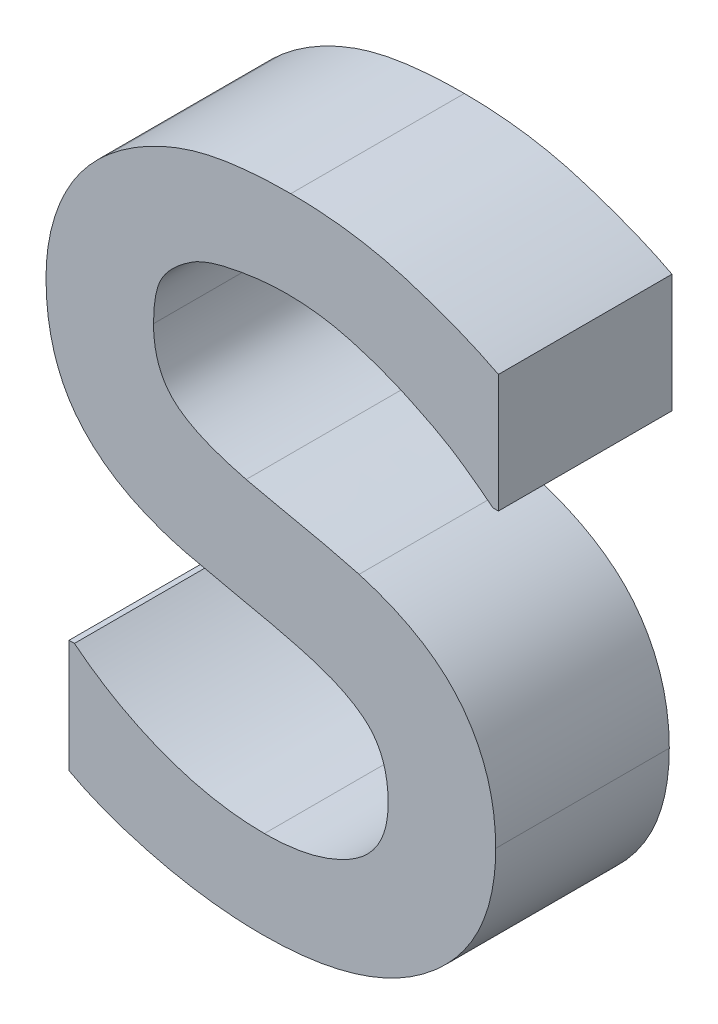
ISO-10303-21;
HEADER;
FILE_DESCRIPTION(('STEP AP214'),'2;1');
FILE_NAME('part.step','',(''),(''),'','','');
FILE_SCHEMA(('AUTOMOTIVE_DESIGN { 1 0 10303 214 1 1 1 1 }'));
ENDSEC;
DATA;
#1=APPLICATION_CONTEXT('core data for automotive mechanical design processes');
#2=APPLICATION_PROTOCOL_DEFINITION('international standard','automotive_design',2000,#1);
#3=PRODUCT_CONTEXT('',#1,'mechanical');
#4=PRODUCT('Part','Part','',(#3));
#5=PRODUCT_RELATED_PRODUCT_CATEGORY('part','',(#4));
#6=PRODUCT_DEFINITION_FORMATION('','',#4);
#7=PRODUCT_DEFINITION_CONTEXT('part definition',#1,'design');
#8=PRODUCT_DEFINITION('design','',#6,#7);
#9=PRODUCT_DEFINITION_SHAPE('','',#8);
#10=(LENGTH_UNIT() NAMED_UNIT(*) SI_UNIT(.MILLI.,.METRE.));
#11=(NAMED_UNIT(*) PLANE_ANGLE_UNIT() SI_UNIT($,.RADIAN.));
#12=(NAMED_UNIT(*) SI_UNIT($,.STERADIAN.) SOLID_ANGLE_UNIT());
#13=UNCERTAINTY_MEASURE_WITH_UNIT(LENGTH_MEASURE(1.E-05),#10,'distance_accuracy_value','');
#14=(GEOMETRIC_REPRESENTATION_CONTEXT(3) GLOBAL_UNCERTAINTY_ASSIGNED_CONTEXT((#13)) GLOBAL_UNIT_ASSIGNED_CONTEXT((#10,
#11,#12)) REPRESENTATION_CONTEXT('',''));
#15=CARTESIAN_POINT('',(0.,0.,0.));
#16=DIRECTION('',(0.,0.,1.));
#17=DIRECTION('',(1.,0.,0.));
#18=AXIS2_PLACEMENT_3D('',#15,#16,#17);
#19=CARTESIAN_POINT('',(-10.361300578822,-7.596890123966,0.));
#20=DIRECTION('',(1.,0.,0.));
#21=DIRECTION('',(0.,1.,0.));
#22=AXIS2_PLACEMENT_3D('',#19,#20,#21);
#23=PLANE('',#22);
#24=DIRECTION('',(0.,-1.,0.));
#25=VECTOR('',#24,1.);
#26=CARTESIAN_POINT('',(-10.361300578822,-7.528715389991,0.));
#27=LINE('',#26,#25);
#28=CARTESIAN_POINT('',(-10.361300578822,-7.528715389991,0.));
#29=VERTEX_POINT('',#28);
#30=CARTESIAN_POINT('',(-10.361300578822,-7.596890123966,0.));
#31=VERTEX_POINT('',#30);
#32=EDGE_CURVE('E11',#29,#31,#27,.T.);
#33=ORIENTED_EDGE('',*,*,#32,.F.);
#34=DIRECTION('',(0.,0.,1.));
#35=VECTOR('',#34,1.);
#36=CARTESIAN_POINT('',(-10.361300578822,-7.528715389991,0.));
#37=LINE('',#36,#35);
#38=CARTESIAN_POINT('',(-10.361300578822,-7.528715389991,0.1));
#39=VERTEX_POINT('',#38);
#40=EDGE_CURVE('E24',#29,#39,#37,.T.);
#41=ORIENTED_EDGE('',*,*,#40,.T.);
#42=DIRECTION('',(0.,1.,0.));
#43=VECTOR('',#42,1.);
#44=CARTESIAN_POINT('',(-10.361300578822,-7.528715389991,0.1));
#45=LINE('',#44,#43);
#46=CARTESIAN_POINT('',(-10.361300578822,-7.596890123966,0.1));
#47=VERTEX_POINT('',#46);
#48=EDGE_CURVE('E178',#47,#39,#45,.T.);
#49=ORIENTED_EDGE('',*,*,#48,.F.);
#50=DIRECTION('',(0.,0.,1.));
#51=VECTOR('',#50,1.);
#52=CARTESIAN_POINT('',(-10.361300578822,-7.596890123966,0.));
#53=LINE('',#52,#51);
#54=EDGE_CURVE('E493',#31,#47,#53,.T.);
#55=ORIENTED_EDGE('',*,*,#54,.F.);
#56=EDGE_LOOP('',(#33,#41,#49,#55));
#57=FACE_BOUND('',#56,.T.);
#58=ADVANCED_FACE('F17',(#57),#23,.T.);
#59=CARTESIAN_POINT('',(-10.36441713809,-7.596890123966,0.));
#60=DIRECTION('',(0.,-1.,0.));
#61=DIRECTION('',(1.,0.,0.));
#62=AXIS2_PLACEMENT_3D('',#59,#60,#61);
#63=PLANE('',#62);
#64=DIRECTION('',(-1.,0.,0.));
#65=VECTOR('',#64,1.);
#66=CARTESIAN_POINT('',(-10.361300578822,-7.596890123966,0.));
#67=LINE('',#66,#65);
#68=CARTESIAN_POINT('',(-10.36441713809,-7.596890123966,0.));
#69=VERTEX_POINT('',#68);
#70=EDGE_CURVE('E491',#31,#69,#67,.T.);
#71=ORIENTED_EDGE('',*,*,#70,.F.);
#72=ORIENTED_EDGE('',*,*,#54,.T.);
#73=DIRECTION('',(1.,0.,0.));
#74=VECTOR('',#73,1.);
#75=CARTESIAN_POINT('',(-10.361300578822,-7.596890123966,0.1));
#76=LINE('',#75,#74);
#77=CARTESIAN_POINT('',(-10.36441713809,-7.596890123966,0.1));
#78=VERTEX_POINT('',#77);
#79=EDGE_CURVE('E489',#78,#47,#76,.T.);
#80=ORIENTED_EDGE('',*,*,#79,.F.);
#81=DIRECTION('',(0.,0.,1.));
#82=VECTOR('',#81,1.);
#83=CARTESIAN_POINT('',(-10.36441713809,-7.596890123966,0.));
#84=LINE('',#83,#82);
#85=EDGE_CURVE('E483',#69,#78,#84,.T.);
#86=ORIENTED_EDGE('',*,*,#85,.F.);
#87=EDGE_LOOP('',(#71,#72,#80,#86));
#88=FACE_BOUND('',#87,.T.);
#89=ADVANCED_FACE('F567',(#88),#63,.T.);
#90=CARTESIAN_POINT('',(-10.410775957193,-7.567672380834,0.));
#91=CARTESIAN_POINT('',(-10.410775957193,-7.567672380834,0.1));
#92=CARTESIAN_POINT('',(-10.393245311313,-7.575853348911,0.));
#93=CARTESIAN_POINT('',(-10.393245311313,-7.575853348911,0.1));
#94=CARTESIAN_POINT('',(-10.372208536258,-7.590657005431,0.));
#95=CARTESIAN_POINT('',(-10.372208536258,-7.590657005431,0.1));
#96=CARTESIAN_POINT('',(-10.36441713809,-7.596890123966,0.));
#97=CARTESIAN_POINT('',(-10.36441713809,-7.596890123966,0.1));
#98=B_SPLINE_SURFACE_WITH_KNOTS('',2,1,((#90,#91),(#92,#93),(#94,#95),(#96,#97)),.UNSPECIFIED.,
.F.,.F.,.F.,(3,1,3),(2,2),(-2.,-1.,0.),(0.,0.01),.UNSPECIFIED.);
#99=CARTESIAN_POINT('',(-10.36441713809,-7.596890123966,0.));
#100=CARTESIAN_POINT('',(-10.372208536258,-7.590657005431,0.));
#101=CARTESIAN_POINT('',(-10.393245311313,-7.575853348911,0.));
#102=CARTESIAN_POINT('',(-10.410775957193,-7.567672380834,0.));
#103=B_SPLINE_CURVE_WITH_KNOTS('',2,(#99,#100,#101,#102),.UNSPECIFIED.,.F.,.F.,(3,1,3),(0.,1.,
2.),.UNSPECIFIED.);
#104=CARTESIAN_POINT('',(-10.410775957193,-7.567672380834,0.));
#105=VERTEX_POINT('',#104);
#106=EDGE_CURVE('E476',#69,#105,#103,.T.);
#107=CARTESIAN_POINT('',(-10.410775957193,-7.567672380834,0.1));
#108=CARTESIAN_POINT('',(-10.393245311313,-7.575853348911,0.1));
#109=CARTESIAN_POINT('',(-10.372208536258,-7.590657005431,0.1));
#110=CARTESIAN_POINT('',(-10.36441713809,-7.596890123966,0.1));
#111=B_SPLINE_CURVE_WITH_KNOTS('',2,(#107,#108,#109,#110),.UNSPECIFIED.,.F.,.F.,(3,1,3),(-2.,
-1.,0.),.UNSPECIFIED.);
#112=CARTESIAN_POINT('',(-10.410775957193,-7.567672380834,0.1));
#113=VERTEX_POINT('',#112);
#114=EDGE_CURVE('E471',#113,#78,#111,.T.);
#115=DIRECTION('',(0.,0.,1.));
#116=VECTOR('',#115,1.);
#117=CARTESIAN_POINT('',(-10.410775957193,-7.567672380834,0.));
#118=LINE('',#117,#116);
#119=EDGE_CURVE('E465',#105,#113,#118,.T.);
#120=ORIENTED_EDGE('',*,*,#106,.F.);
#121=ORIENTED_EDGE('',*,*,#85,.T.);
#122=ORIENTED_EDGE('',*,*,#114,.F.);
#123=ORIENTED_EDGE('',*,*,#119,.F.);
#124=EDGE_LOOP('',(#120,#121,#122,#123));
#125=FACE_BOUND('',#124,.T.);
#126=ADVANCED_FACE('F563',(#125),#98,.T.);
#127=CARTESIAN_POINT('',(-10.48323596016,-7.549362595138,0.));
#128=CARTESIAN_POINT('',(-10.48323596016,-7.549362595138,0.1));
#129=CARTESIAN_POINT('',(-10.46336789483,-7.549362595138,0.));
#130=CARTESIAN_POINT('',(-10.46336789483,-7.549362595138,0.1));
#131=CARTESIAN_POINT('',(-10.425969183621,-7.560270552574,0.));
#132=CARTESIAN_POINT('',(-10.425969183621,-7.560270552574,0.1));
#133=CARTESIAN_POINT('',(-10.410775957193,-7.567672380834,0.));
#134=CARTESIAN_POINT('',(-10.410775957193,-7.567672380834,0.1));
#135=B_SPLINE_SURFACE_WITH_KNOTS('',2,1,((#127,#128),(#129,#130),(#131,#132),(#133,#134)),
.UNSPECIFIED.,.F.,.F.,.F.,(3,1,3),(2,2),(-2.,-1.,0.),(0.,0.01),.UNSPECIFIED.);
#136=CARTESIAN_POINT('',(-10.410775957193,-7.567672380834,0.));
#137=CARTESIAN_POINT('',(-10.425969183621,-7.560270552574,0.));
#138=CARTESIAN_POINT('',(-10.46336789483,-7.549362595138,0.));
#139=CARTESIAN_POINT('',(-10.48323596016,-7.549362595138,0.));
#140=B_SPLINE_CURVE_WITH_KNOTS('',2,(#136,#137,#138,#139),.UNSPECIFIED.,.F.,.F.,(3,1,3),(0.,1.,
2.),.UNSPECIFIED.);
#141=CARTESIAN_POINT('',(-10.48323596016,-7.549362595138,0.));
#142=VERTEX_POINT('',#141);
#143=EDGE_CURVE('E458',#105,#142,#140,.T.);
#144=CARTESIAN_POINT('',(-10.48323596016,-7.549362595138,0.1));
#145=CARTESIAN_POINT('',(-10.46336789483,-7.549362595138,0.1));
#146=CARTESIAN_POINT('',(-10.425969183621,-7.560270552574,0.1));
#147=CARTESIAN_POINT('',(-10.410775957193,-7.567672380834,0.1));
#148=B_SPLINE_CURVE_WITH_KNOTS('',2,(#144,#145,#146,#147),.UNSPECIFIED.,.F.,.F.,(3,1,3),(-2.,
-1.,0.),.UNSPECIFIED.);
#149=CARTESIAN_POINT('',(-10.48323596016,-7.549362595138,0.1));
#150=VERTEX_POINT('',#149);
#151=EDGE_CURVE('E453',#150,#113,#148,.T.);
#152=DIRECTION('',(0.,0.,1.));
#153=VECTOR('',#152,1.);
#154=CARTESIAN_POINT('',(-10.48323596016,-7.549362595138,0.));
#155=LINE('',#154,#153);
#156=EDGE_CURVE('E447',#142,#150,#155,.T.);
#157=ORIENTED_EDGE('',*,*,#143,.F.);
#158=ORIENTED_EDGE('',*,*,#119,.T.);
#159=ORIENTED_EDGE('',*,*,#151,.F.);
#160=ORIENTED_EDGE('',*,*,#156,.F.);
#161=EDGE_LOOP('',(#157,#158,#159,#160));
#162=FACE_BOUND('',#161,.T.);
#163=ADVANCED_FACE('F559',(#162),#135,.T.);
#164=CARTESIAN_POINT('',(-10.538554887157,-7.561439262299,0.));
#165=CARTESIAN_POINT('',(-10.538554887157,-7.561439262299,0.1));
#166=CARTESIAN_POINT('',(-10.530763488989,-7.555985283581,0.));
#167=CARTESIAN_POINT('',(-10.530763488989,-7.555985283581,0.1));
#168=CARTESIAN_POINT('',(-10.497650046772,-7.549362595138,0.));
#169=CARTESIAN_POINT('',(-10.497650046772,-7.549362595138,0.1));
#170=CARTESIAN_POINT('',(-10.48323596016,-7.549362595138,0.));
#171=CARTESIAN_POINT('',(-10.48323596016,-7.549362595138,0.1));
#172=B_SPLINE_SURFACE_WITH_KNOTS('',2,1,((#164,#165),(#166,#167),(#168,#169),(#170,#171)),
.UNSPECIFIED.,.F.,.F.,.F.,(3,1,3),(2,2),(-2.,-1.,0.),(0.,0.01),.UNSPECIFIED.);
#173=CARTESIAN_POINT('',(-10.48323596016,-7.549362595138,0.));
#174=CARTESIAN_POINT('',(-10.497650046772,-7.549362595138,0.));
#175=CARTESIAN_POINT('',(-10.530763488989,-7.555985283581,0.));
#176=CARTESIAN_POINT('',(-10.538554887157,-7.561439262299,0.));
#177=B_SPLINE_CURVE_WITH_KNOTS('',2,(#173,#174,#175,#176),.UNSPECIFIED.,.F.,.F.,(3,1,3),(0.,1.,
2.),.UNSPECIFIED.);
#178=CARTESIAN_POINT('',(-10.538554887157,-7.561439262299,0.));
#179=VERTEX_POINT('',#178);
#180=EDGE_CURVE('E440',#142,#179,#177,.T.);
#181=CARTESIAN_POINT('',(-10.538554887157,-7.561439262299,0.1));
#182=CARTESIAN_POINT('',(-10.530763488989,-7.555985283581,0.1));
#183=CARTESIAN_POINT('',(-10.497650046772,-7.549362595138,0.1));
#184=CARTESIAN_POINT('',(-10.48323596016,-7.549362595138,0.1));
#185=B_SPLINE_CURVE_WITH_KNOTS('',2,(#181,#182,#183,#184),.UNSPECIFIED.,.F.,.F.,(3,1,3),(-2.,
-1.,0.),.UNSPECIFIED.);
#186=CARTESIAN_POINT('',(-10.538554887157,-7.561439262299,0.1));
#187=VERTEX_POINT('',#186);
#188=EDGE_CURVE('E435',#187,#150,#185,.T.);
#189=DIRECTION('',(0.,0.,1.));
#190=VECTOR('',#189,1.);
#191=CARTESIAN_POINT('',(-10.538554887157,-7.561439262299,0.));
#192=LINE('',#191,#190);
#193=EDGE_CURVE('E429',#179,#187,#192,.T.);
#194=ORIENTED_EDGE('',*,*,#180,.F.);
#195=ORIENTED_EDGE('',*,*,#156,.T.);
#196=ORIENTED_EDGE('',*,*,#188,.F.);
#197=ORIENTED_EDGE('',*,*,#193,.F.);
#198=EDGE_LOOP('',(#194,#195,#196,#197));
#199=FACE_BOUND('',#198,.T.);
#200=ADVANCED_FACE('F555',(#199),#172,.T.);
#201=CARTESIAN_POINT('',(-10.559981232121,-7.602733672593,0.));
#202=CARTESIAN_POINT('',(-10.559981232121,-7.602733672593,0.1));
#203=CARTESIAN_POINT('',(-10.559981232121,-7.585592596622,0.));
#204=CARTESIAN_POINT('',(-10.559981232121,-7.585592596622,0.1));
#205=CARTESIAN_POINT('',(-10.549852414502,-7.568841090559,0.));
#206=CARTESIAN_POINT('',(-10.549852414502,-7.568841090559,0.1));
#207=CARTESIAN_POINT('',(-10.538554887157,-7.561439262299,0.));
#208=CARTESIAN_POINT('',(-10.538554887157,-7.561439262299,0.1));
#209=B_SPLINE_SURFACE_WITH_KNOTS('',2,1,((#201,#202),(#203,#204),(#205,#206),(#207,#208)),
.UNSPECIFIED.,.F.,.F.,.F.,(3,1,3),(2,2),(-2.,-1.,0.),(0.,0.01),.UNSPECIFIED.);
#210=CARTESIAN_POINT('',(-10.538554887157,-7.561439262299,0.));
#211=CARTESIAN_POINT('',(-10.549852414502,-7.568841090559,0.));
#212=CARTESIAN_POINT('',(-10.559981232121,-7.585592596622,0.));
#213=CARTESIAN_POINT('',(-10.559981232121,-7.602733672593,0.));
#214=B_SPLINE_CURVE_WITH_KNOTS('',2,(#210,#211,#212,#213),.UNSPECIFIED.,.F.,.F.,(3,1,3),(0.,1.,
2.),.UNSPECIFIED.);
#215=CARTESIAN_POINT('',(-10.559981232121,-7.602733672593,0.));
#216=VERTEX_POINT('',#215);
#217=EDGE_CURVE('E422',#179,#216,#214,.T.);
#218=CARTESIAN_POINT('',(-10.559981232121,-7.602733672593,0.1));
#219=CARTESIAN_POINT('',(-10.559981232121,-7.585592596622,0.1));
#220=CARTESIAN_POINT('',(-10.549852414502,-7.568841090559,0.1));
#221=CARTESIAN_POINT('',(-10.538554887157,-7.561439262299,0.1));
#222=B_SPLINE_CURVE_WITH_KNOTS('',2,(#218,#219,#220,#221),.UNSPECIFIED.,.F.,.F.,(3,1,3),(-2.,
-1.,0.),.UNSPECIFIED.);
#223=CARTESIAN_POINT('',(-10.559981232121,-7.602733672593,0.1));
#224=VERTEX_POINT('',#223);
#225=EDGE_CURVE('E417',#224,#187,#222,.T.);
#226=DIRECTION('',(0.,0.,1.));
#227=VECTOR('',#226,1.);
#228=CARTESIAN_POINT('',(-10.559981232121,-7.602733672593,0.));
#229=LINE('',#228,#227);
#230=EDGE_CURVE('E411',#216,#224,#229,.T.);
#231=ORIENTED_EDGE('',*,*,#217,.F.);
#232=ORIENTED_EDGE('',*,*,#193,.T.);
#233=ORIENTED_EDGE('',*,*,#225,.F.);
#234=ORIENTED_EDGE('',*,*,#230,.F.);
#235=EDGE_LOOP('',(#231,#232,#233,#234));
#236=FACE_BOUND('',#235,.T.);
#237=ADVANCED_FACE('F551',(#236),#209,.T.);
#238=CARTESIAN_POINT('',(-10.506610154666,-7.653767330597,0.));
#239=CARTESIAN_POINT('',(-10.506610154666,-7.653767330597,0.1));
#240=CARTESIAN_POINT('',(-10.536607037615,-7.646365502337,0.));
#241=CARTESIAN_POINT('',(-10.536607037615,-7.646365502337,0.1));
#242=CARTESIAN_POINT('',(-10.559981232121,-7.624160017556,0.));
#243=CARTESIAN_POINT('',(-10.559981232121,-7.624160017556,0.1));
#244=CARTESIAN_POINT('',(-10.559981232121,-7.602733672593,0.));
#245=CARTESIAN_POINT('',(-10.559981232121,-7.602733672593,0.1));
#246=B_SPLINE_SURFACE_WITH_KNOTS('',2,1,((#238,#239),(#240,#241),(#242,#243),(#244,#245)),
.UNSPECIFIED.,.F.,.F.,.F.,(3,1,3),(2,2),(-2.,-1.,0.),(0.,0.01),.UNSPECIFIED.);
#247=CARTESIAN_POINT('',(-10.559981232121,-7.602733672593,0.));
#248=CARTESIAN_POINT('',(-10.559981232121,-7.624160017556,0.));
#249=CARTESIAN_POINT('',(-10.536607037615,-7.646365502337,0.));
#250=CARTESIAN_POINT('',(-10.506610154666,-7.653767330597,0.));
#251=B_SPLINE_CURVE_WITH_KNOTS('',2,(#247,#248,#249,#250),.UNSPECIFIED.,.F.,.F.,(3,1,3),(0.,1.,
2.),.UNSPECIFIED.);
#252=CARTESIAN_POINT('',(-10.506610154666,-7.653767330597,0.));
#253=VERTEX_POINT('',#252);
#254=EDGE_CURVE('E404',#216,#253,#251,.T.);
#255=CARTESIAN_POINT('',(-10.506610154666,-7.653767330597,0.1));
#256=CARTESIAN_POINT('',(-10.536607037615,-7.646365502337,0.1));
#257=CARTESIAN_POINT('',(-10.559981232121,-7.624160017556,0.1));
#258=CARTESIAN_POINT('',(-10.559981232121,-7.602733672593,0.1));
#259=B_SPLINE_CURVE_WITH_KNOTS('',2,(#255,#256,#257,#258),.UNSPECIFIED.,.F.,.F.,(3,1,3),(-2.,
-1.,0.),.UNSPECIFIED.);
#260=CARTESIAN_POINT('',(-10.506610154666,-7.653767330597,0.1));
#261=VERTEX_POINT('',#260);
#262=EDGE_CURVE('E399',#261,#224,#259,.T.);
#263=DIRECTION('',(0.,0.,1.));
#264=VECTOR('',#263,1.);
#265=CARTESIAN_POINT('',(-10.506610154666,-7.653767330597,0.));
#266=LINE('',#265,#264);
#267=EDGE_CURVE('E393',#253,#261,#266,.T.);
#268=ORIENTED_EDGE('',*,*,#254,.F.);
#269=ORIENTED_EDGE('',*,*,#230,.T.);
#270=ORIENTED_EDGE('',*,*,#262,.F.);
#271=ORIENTED_EDGE('',*,*,#267,.F.);
#272=EDGE_LOOP('',(#268,#269,#270,#271));
#273=FACE_BOUND('',#272,.T.);
#274=ADVANCED_FACE('F547',(#273),#246,.T.);
#275=CARTESIAN_POINT('',(-10.441551979958,-7.668570987117,0.));
#276=CARTESIAN_POINT('',(-10.441551979958,-7.668570987117,0.1));
#277=CARTESIAN_POINT('',(-10.457524346204,-7.664285718125,0.));
#278=CARTESIAN_POINT('',(-10.457524346204,-7.664285718125,0.1));
#279=CARTESIAN_POINT('',(-10.494923057413,-7.656494319956,0.));
#280=CARTESIAN_POINT('',(-10.494923057413,-7.656494319956,0.1));
#281=CARTESIAN_POINT('',(-10.506610154666,-7.653767330597,0.));
#282=CARTESIAN_POINT('',(-10.506610154666,-7.653767330597,0.1));
#283=B_SPLINE_SURFACE_WITH_KNOTS('',2,1,((#275,#276),(#277,#278),(#279,#280),(#281,#282)),
.UNSPECIFIED.,.F.,.F.,.F.,(3,1,3),(2,2),(-2.,-1.,0.),(0.,0.01),.UNSPECIFIED.);
#284=CARTESIAN_POINT('',(-10.506610154666,-7.653767330597,0.));
#285=CARTESIAN_POINT('',(-10.494923057413,-7.656494319956,0.));
#286=CARTESIAN_POINT('',(-10.457524346204,-7.664285718125,0.));
#287=CARTESIAN_POINT('',(-10.441551979958,-7.668570987117,0.));
#288=B_SPLINE_CURVE_WITH_KNOTS('',2,(#284,#285,#286,#287),.UNSPECIFIED.,.F.,.F.,(3,1,3),(0.,1.,
2.),.UNSPECIFIED.);
#289=CARTESIAN_POINT('',(-10.441551979958,-7.668570987117,0.));
#290=VERTEX_POINT('',#289);
#291=EDGE_CURVE('E386',#253,#290,#288,.T.);
#292=CARTESIAN_POINT('',(-10.441551979958,-7.668570987117,0.1));
#293=CARTESIAN_POINT('',(-10.457524346204,-7.664285718125,0.1));
#294=CARTESIAN_POINT('',(-10.494923057413,-7.656494319956,0.1));
#295=CARTESIAN_POINT('',(-10.506610154666,-7.653767330597,0.1));
#296=B_SPLINE_CURVE_WITH_KNOTS('',2,(#292,#293,#294,#295),.UNSPECIFIED.,.F.,.F.,(3,1,3),(-2.,
-1.,0.),.UNSPECIFIED.);
#297=CARTESIAN_POINT('',(-10.441551979958,-7.668570987117,0.1));
#298=VERTEX_POINT('',#297);
#299=EDGE_CURVE('E381',#298,#261,#296,.T.);
#300=DIRECTION('',(0.,0.,1.));
#301=VECTOR('',#300,1.);
#302=CARTESIAN_POINT('',(-10.441551979958,-7.668570987117,0.));
#303=LINE('',#302,#301);
#304=EDGE_CURVE('E375',#290,#298,#303,.T.);
#305=ORIENTED_EDGE('',*,*,#291,.F.);
#306=ORIENTED_EDGE('',*,*,#267,.T.);
#307=ORIENTED_EDGE('',*,*,#299,.F.);
#308=ORIENTED_EDGE('',*,*,#304,.F.);
#309=EDGE_LOOP('',(#305,#306,#307,#308));
#310=FACE_BOUND('',#309,.T.);
#311=ADVANCED_FACE('F543',(#310),#283,.T.);
#312=CARTESIAN_POINT('',(-10.362858858456,-7.765963464224,0.));
#313=CARTESIAN_POINT('',(-10.362858858456,-7.765963464224,0.1));
#314=CARTESIAN_POINT('',(-10.362858858456,-7.730512602557,0.));
#315=CARTESIAN_POINT('',(-10.362858858456,-7.730512602557,0.1));
#316=CARTESIAN_POINT('',(-10.400257569665,-7.680647654279,0.));
#317=CARTESIAN_POINT('',(-10.400257569665,-7.680647654279,0.1));
#318=CARTESIAN_POINT('',(-10.441551979958,-7.668570987117,0.));
#319=CARTESIAN_POINT('',(-10.441551979958,-7.668570987117,0.1));
#320=B_SPLINE_SURFACE_WITH_KNOTS('',2,1,((#312,#313),(#314,#315),(#316,#317),(#318,#319)),
.UNSPECIFIED.,.F.,.F.,.F.,(3,1,3),(2,2),(-2.,-1.,0.),(0.,0.01),.UNSPECIFIED.);
#321=CARTESIAN_POINT('',(-10.441551979958,-7.668570987117,0.));
#322=CARTESIAN_POINT('',(-10.400257569665,-7.680647654279,0.));
#323=CARTESIAN_POINT('',(-10.362858858456,-7.730512602557,0.));
#324=CARTESIAN_POINT('',(-10.362858858456,-7.765963464224,0.));
#325=B_SPLINE_CURVE_WITH_KNOTS('',2,(#321,#322,#323,#324),.UNSPECIFIED.,.F.,.F.,(3,1,3),(0.,1.,
2.),.UNSPECIFIED.);
#326=CARTESIAN_POINT('',(-10.362858858456,-7.765963464224,0.));
#327=VERTEX_POINT('',#326);
#328=EDGE_CURVE('E368',#290,#327,#325,.T.);
#329=CARTESIAN_POINT('',(-10.362858858456,-7.765963464224,0.1));
#330=CARTESIAN_POINT('',(-10.362858858456,-7.730512602557,0.1));
#331=CARTESIAN_POINT('',(-10.400257569665,-7.680647654279,0.1));
#332=CARTESIAN_POINT('',(-10.441551979958,-7.668570987117,0.1));
#333=B_SPLINE_CURVE_WITH_KNOTS('',2,(#329,#330,#331,#332),.UNSPECIFIED.,.F.,.F.,(3,1,3),(-2.,
-1.,0.),.UNSPECIFIED.);
#334=CARTESIAN_POINT('',(-10.362858858456,-7.765963464224,0.1));
#335=VERTEX_POINT('',#334);
#336=EDGE_CURVE('E363',#335,#298,#333,.T.);
#337=DIRECTION('',(0.,0.,1.));
#338=VECTOR('',#337,1.);
#339=CARTESIAN_POINT('',(-10.362858858456,-7.765963464224,0.));
#340=LINE('',#339,#338);
#341=EDGE_CURVE('E357',#327,#335,#340,.T.);
#342=ORIENTED_EDGE('',*,*,#328,.F.);
#343=ORIENTED_EDGE('',*,*,#304,.T.);
#344=ORIENTED_EDGE('',*,*,#336,.F.);
#345=ORIENTED_EDGE('',*,*,#341,.F.);
#346=EDGE_LOOP('',(#342,#343,#344,#345));
#347=FACE_BOUND('',#346,.T.);
#348=ADVANCED_FACE('F539',(#347),#320,.T.);
#349=CARTESIAN_POINT('',(-10.497260476864,-7.87621174831,0.));
#350=CARTESIAN_POINT('',(-10.497260476864,-7.87621174831,0.1));
#351=CARTESIAN_POINT('',(-10.436487571149,-7.87621174831,0.));
#352=CARTESIAN_POINT('',(-10.436487571149,-7.87621174831,0.1));
#353=CARTESIAN_POINT('',(-10.362858858456,-7.815049272686,0.));
#354=CARTESIAN_POINT('',(-10.362858858456,-7.815049272686,0.1));
#355=CARTESIAN_POINT('',(-10.362858858456,-7.765963464224,0.));
#356=CARTESIAN_POINT('',(-10.362858858456,-7.765963464224,0.1));
#357=B_SPLINE_SURFACE_WITH_KNOTS('',2,1,((#349,#350),(#351,#352),(#353,#354),(#355,#356)),
.UNSPECIFIED.,.F.,.F.,.F.,(3,1,3),(2,2),(-2.,-1.,0.),(0.,0.01),.UNSPECIFIED.);
#358=CARTESIAN_POINT('',(-10.362858858456,-7.765963464224,0.));
#359=CARTESIAN_POINT('',(-10.362858858456,-7.815049272686,0.));
#360=CARTESIAN_POINT('',(-10.436487571149,-7.87621174831,0.));
#361=CARTESIAN_POINT('',(-10.497260476864,-7.87621174831,0.));
#362=B_SPLINE_CURVE_WITH_KNOTS('',2,(#358,#359,#360,#361),.UNSPECIFIED.,.F.,.F.,(3,1,3),(0.,1.,
2.),.UNSPECIFIED.);
#363=CARTESIAN_POINT('',(-10.497260476864,-7.87621174831,0.));
#364=VERTEX_POINT('',#363);
#365=EDGE_CURVE('E350',#327,#364,#362,.T.);
#366=CARTESIAN_POINT('',(-10.497260476864,-7.87621174831,0.1));
#367=CARTESIAN_POINT('',(-10.436487571149,-7.87621174831,0.1));
#368=CARTESIAN_POINT('',(-10.362858858456,-7.815049272686,0.1));
#369=CARTESIAN_POINT('',(-10.362858858456,-7.765963464224,0.1));
#370=B_SPLINE_CURVE_WITH_KNOTS('',2,(#366,#367,#368,#369),.UNSPECIFIED.,.F.,.F.,(3,1,3),(-2.,
-1.,0.),.UNSPECIFIED.);
#371=CARTESIAN_POINT('',(-10.497260476864,-7.87621174831,0.1));
#372=VERTEX_POINT('',#371);
#373=EDGE_CURVE('E345',#372,#335,#370,.T.);
#374=DIRECTION('',(0.,0.,1.));
#375=VECTOR('',#374,1.);
#376=CARTESIAN_POINT('',(-10.497260476864,-7.87621174831,0.));
#377=LINE('',#376,#375);
#378=EDGE_CURVE('E339',#364,#372,#377,.T.);
#379=ORIENTED_EDGE('',*,*,#365,.F.);
#380=ORIENTED_EDGE('',*,*,#341,.T.);
#381=ORIENTED_EDGE('',*,*,#373,.F.);
#382=ORIENTED_EDGE('',*,*,#378,.F.);
#383=EDGE_LOOP('',(#379,#380,#381,#382));
#384=FACE_BOUND('',#383,.T.);
#385=ADVANCED_FACE('F535',(#384),#357,.T.);
#386=CARTESIAN_POINT('',(-10.608677470674,-7.850110564445,0.));
#387=CARTESIAN_POINT('',(-10.608677470674,-7.850110564445,0.1));
#388=CARTESIAN_POINT('',(-10.588030265528,-7.86140809179,0.));
#389=CARTESIAN_POINT('',(-10.588030265528,-7.86140809179,0.1));
#390=CARTESIAN_POINT('',(-10.527257359813,-7.87621174831,0.));
#391=CARTESIAN_POINT('',(-10.527257359813,-7.87621174831,0.1));
#392=CARTESIAN_POINT('',(-10.497260476864,-7.87621174831,0.));
#393=CARTESIAN_POINT('',(-10.497260476864,-7.87621174831,0.1));
#394=B_SPLINE_SURFACE_WITH_KNOTS('',2,1,((#386,#387),(#388,#389),(#390,#391),(#392,#393)),
.UNSPECIFIED.,.F.,.F.,.F.,(3,1,3),(2,2),(-2.,-1.,0.),(0.,0.01),.UNSPECIFIED.);
#395=CARTESIAN_POINT('',(-10.497260476864,-7.87621174831,0.));
#396=CARTESIAN_POINT('',(-10.527257359813,-7.87621174831,0.));
#397=CARTESIAN_POINT('',(-10.588030265528,-7.86140809179,0.));
#398=CARTESIAN_POINT('',(-10.608677470674,-7.850110564445,0.));
#399=B_SPLINE_CURVE_WITH_KNOTS('',2,(#395,#396,#397,#398),.UNSPECIFIED.,.F.,.F.,(3,1,3),(0.,1.,
2.),.UNSPECIFIED.);
#400=CARTESIAN_POINT('',(-10.608677470674,-7.850110564445,0.));
#401=VERTEX_POINT('',#400);
#402=EDGE_CURVE('E332',#364,#401,#399,.T.);
#403=CARTESIAN_POINT('',(-10.608677470674,-7.850110564445,0.1));
#404=CARTESIAN_POINT('',(-10.588030265528,-7.86140809179,0.1));
#405=CARTESIAN_POINT('',(-10.527257359813,-7.87621174831,0.1));
#406=CARTESIAN_POINT('',(-10.497260476864,-7.87621174831,0.1));
#407=B_SPLINE_CURVE_WITH_KNOTS('',2,(#403,#404,#405,#406),.UNSPECIFIED.,.F.,.F.,(3,1,3),(-2.,
-1.,0.),.UNSPECIFIED.);
#408=CARTESIAN_POINT('',(-10.608677470674,-7.850110564445,0.1));
#409=VERTEX_POINT('',#408);
#410=EDGE_CURVE('E327',#409,#372,#407,.T.);
#411=DIRECTION('',(0.,0.,1.));
#412=VECTOR('',#411,1.);
#413=CARTESIAN_POINT('',(-10.608677470674,-7.850110564445,0.));
#414=LINE('',#413,#412);
#415=EDGE_CURVE('E324',#401,#409,#414,.T.);
#416=ORIENTED_EDGE('',*,*,#402,.F.);
#417=ORIENTED_EDGE('',*,*,#378,.T.);
#418=ORIENTED_EDGE('',*,*,#410,.F.);
#419=ORIENTED_EDGE('',*,*,#415,.F.);
#420=EDGE_LOOP('',(#416,#417,#418,#419));
#421=FACE_BOUND('',#420,.T.);
#422=ADVANCED_FACE('F531',(#421),#394,.T.);
#423=CARTESIAN_POINT('',(-10.608677470674,-7.785052389737,0.));
#424=DIRECTION('',(-1.,0.,0.));
#425=DIRECTION('',(0.,-1.,0.));
#426=AXIS2_PLACEMENT_3D('',#423,#424,#425);
#427=PLANE('',#426);
#428=DIRECTION('',(0.,1.,0.));
#429=VECTOR('',#428,1.);
#430=CARTESIAN_POINT('',(-10.608677470674,-7.850110564445,0.));
#431=LINE('',#430,#429);
#432=CARTESIAN_POINT('',(-10.608677470674,-7.785052389737,0.));
#433=VERTEX_POINT('',#432);
#434=EDGE_CURVE('E322',#401,#433,#431,.T.);
#435=ORIENTED_EDGE('',*,*,#434,.F.);
#436=ORIENTED_EDGE('',*,*,#415,.T.);
#437=DIRECTION('',(0.,-1.,0.));
#438=VECTOR('',#437,1.);
#439=CARTESIAN_POINT('',(-10.608677470674,-7.850110564445,0.1));
#440=LINE('',#439,#438);
#441=CARTESIAN_POINT('',(-10.608677470674,-7.785052389737,0.1));
#442=VERTEX_POINT('',#441);
#443=EDGE_CURVE('E319',#442,#409,#440,.T.);
#444=ORIENTED_EDGE('',*,*,#443,.F.);
#445=DIRECTION('',(0.,0.,1.));
#446=VECTOR('',#445,1.);
#447=CARTESIAN_POINT('',(-10.608677470674,-7.785052389737,0.));
#448=LINE('',#447,#446);
#449=EDGE_CURVE('E316',#433,#442,#448,.T.);
#450=ORIENTED_EDGE('',*,*,#449,.F.);
#451=EDGE_LOOP('',(#435,#436,#444,#450));
#452=FACE_BOUND('',#451,.T.);
#453=ADVANCED_FACE('F527',(#452),#427,.T.);
#454=CARTESIAN_POINT('',(-10.605560911407,-7.785052389737,0.));
#455=DIRECTION('',(0.,1.,0.));
#456=DIRECTION('',(-1.,0.,0.));
#457=AXIS2_PLACEMENT_3D('',#454,#455,#456);
#458=PLANE('',#457);
#459=DIRECTION('',(1.,0.,0.));
#460=VECTOR('',#459,1.);
#461=CARTESIAN_POINT('',(-10.608677470674,-7.785052389737,0.));
#462=LINE('',#461,#460);
#463=CARTESIAN_POINT('',(-10.605560911407,-7.785052389737,0.));
#464=VERTEX_POINT('',#463);
#465=EDGE_CURVE('E314',#433,#464,#462,.T.);
#466=ORIENTED_EDGE('',*,*,#465,.F.);
#467=ORIENTED_EDGE('',*,*,#449,.T.);
#468=DIRECTION('',(-1.,0.,0.));
#469=VECTOR('',#468,1.);
#470=CARTESIAN_POINT('',(-10.608677470674,-7.785052389737,0.1));
#471=LINE('',#470,#469);
#472=CARTESIAN_POINT('',(-10.605560911407,-7.785052389737,0.1));
#473=VERTEX_POINT('',#472);
#474=EDGE_CURVE('E311',#473,#442,#471,.T.);
#475=ORIENTED_EDGE('',*,*,#474,.F.);
#476=DIRECTION('',(0.,0.,1.));
#477=VECTOR('',#476,1.);
#478=CARTESIAN_POINT('',(-10.605560911407,-7.785052389737,0.));
#479=LINE('',#478,#477);
#480=EDGE_CURVE('E305',#464,#473,#479,.T.);
#481=ORIENTED_EDGE('',*,*,#480,.F.);
#482=EDGE_LOOP('',(#466,#467,#475,#481));
#483=FACE_BOUND('',#482,.T.);
#484=ADVANCED_FACE('F523',(#483),#458,.T.);
#485=CARTESIAN_POINT('',(-10.496091767138,-7.825178090306,0.));
#486=CARTESIAN_POINT('',(-10.496091767138,-7.825178090306,0.1));
#487=CARTESIAN_POINT('',(-10.525309510271,-7.825178090306,0.));
#488=CARTESIAN_POINT('',(-10.525309510271,-7.825178090306,0.1));
#489=CARTESIAN_POINT('',(-10.582186716901,-7.803751745342,0.));
#490=CARTESIAN_POINT('',(-10.582186716901,-7.803751745342,0.1));
#491=CARTESIAN_POINT('',(-10.605560911407,-7.785052389737,0.));
#492=CARTESIAN_POINT('',(-10.605560911407,-7.785052389737,0.1));
#493=B_SPLINE_SURFACE_WITH_KNOTS('',2,1,((#485,#486),(#487,#488),(#489,#490),(#491,#492)),
.UNSPECIFIED.,.F.,.F.,.F.,(3,1,3),(2,2),(-2.,-1.,0.),(0.,0.01),.UNSPECIFIED.);
#494=CARTESIAN_POINT('',(-10.605560911407,-7.785052389737,0.));
#495=CARTESIAN_POINT('',(-10.582186716901,-7.803751745342,0.));
#496=CARTESIAN_POINT('',(-10.525309510271,-7.825178090306,0.));
#497=CARTESIAN_POINT('',(-10.496091767138,-7.825178090306,0.));
#498=B_SPLINE_CURVE_WITH_KNOTS('',2,(#494,#495,#496,#497),.UNSPECIFIED.,.F.,.F.,(3,1,3),(0.,1.,
2.),.UNSPECIFIED.);
#499=CARTESIAN_POINT('',(-10.496091767138,-7.825178090306,0.));
#500=VERTEX_POINT('',#499);
#501=EDGE_CURVE('E298',#464,#500,#498,.T.);
#502=CARTESIAN_POINT('',(-10.496091767138,-7.825178090306,0.1));
#503=CARTESIAN_POINT('',(-10.525309510271,-7.825178090306,0.1));
#504=CARTESIAN_POINT('',(-10.582186716901,-7.803751745342,0.1));
#505=CARTESIAN_POINT('',(-10.605560911407,-7.785052389737,0.1));
#506=B_SPLINE_CURVE_WITH_KNOTS('',2,(#502,#503,#504,#505),.UNSPECIFIED.,.F.,.F.,(3,1,3),(-2.,
-1.,0.),.UNSPECIFIED.);
#507=CARTESIAN_POINT('',(-10.496091767138,-7.825178090306,0.1));
#508=VERTEX_POINT('',#507);
#509=EDGE_CURVE('E293',#508,#473,#506,.T.);
#510=DIRECTION('',(0.,0.,1.));
#511=VECTOR('',#510,1.);
#512=CARTESIAN_POINT('',(-10.496091767138,-7.825178090306,0.));
#513=LINE('',#512,#511);
#514=EDGE_CURVE('E287',#500,#508,#513,.T.);
#515=ORIENTED_EDGE('',*,*,#501,.F.);
#516=ORIENTED_EDGE('',*,*,#480,.T.);
#517=ORIENTED_EDGE('',*,*,#509,.F.);
#518=ORIENTED_EDGE('',*,*,#514,.F.);
#519=EDGE_LOOP('',(#515,#516,#517,#518));
#520=FACE_BOUND('',#519,.T.);
#521=ADVANCED_FACE('F519',(#520),#493,.T.);
#522=CARTESIAN_POINT('',(-10.424800473896,-7.77453400221,0.));
#523=CARTESIAN_POINT('',(-10.424800473896,-7.77453400221,0.1));
#524=CARTESIAN_POINT('',(-10.424800473896,-7.799856046258,0.));
#525=CARTESIAN_POINT('',(-10.424800473896,-7.799856046258,0.1));
#526=CARTESIAN_POINT('',(-10.466094884189,-7.825178090306,0.));
#527=CARTESIAN_POINT('',(-10.466094884189,-7.825178090306,0.1));
#528=CARTESIAN_POINT('',(-10.496091767138,-7.825178090306,0.));
#529=CARTESIAN_POINT('',(-10.496091767138,-7.825178090306,0.1));
#530=B_SPLINE_SURFACE_WITH_KNOTS('',2,1,((#522,#523),(#524,#525),(#526,#527),(#528,#529)),
.UNSPECIFIED.,.F.,.F.,.F.,(3,1,3),(2,2),(-2.,-1.,0.),(0.,0.01),.UNSPECIFIED.);
#531=CARTESIAN_POINT('',(-10.496091767138,-7.825178090306,0.));
#532=CARTESIAN_POINT('',(-10.466094884189,-7.825178090306,0.));
#533=CARTESIAN_POINT('',(-10.424800473896,-7.799856046258,0.));
#534=CARTESIAN_POINT('',(-10.424800473896,-7.77453400221,0.));
#535=B_SPLINE_CURVE_WITH_KNOTS('',2,(#531,#532,#533,#534),.UNSPECIFIED.,.F.,.F.,(3,1,3),(0.,1.,
2.),.UNSPECIFIED.);
#536=CARTESIAN_POINT('',(-10.424800473896,-7.77453400221,0.));
#537=VERTEX_POINT('',#536);
#538=EDGE_CURVE('E280',#500,#537,#535,.T.);
#539=CARTESIAN_POINT('',(-10.424800473896,-7.77453400221,0.1));
#540=CARTESIAN_POINT('',(-10.424800473896,-7.799856046258,0.1));
#541=CARTESIAN_POINT('',(-10.466094884189,-7.825178090306,0.1));
#542=CARTESIAN_POINT('',(-10.496091767138,-7.825178090306,0.1));
#543=B_SPLINE_CURVE_WITH_KNOTS('',2,(#539,#540,#541,#542),.UNSPECIFIED.,.F.,.F.,(3,1,3),(-2.,
-1.,0.),.UNSPECIFIED.);
#544=CARTESIAN_POINT('',(-10.424800473896,-7.77453400221,0.1));
#545=VERTEX_POINT('',#544);
#546=EDGE_CURVE('E275',#545,#508,#543,.T.);
#547=DIRECTION('',(0.,0.,1.));
#548=VECTOR('',#547,1.);
#549=CARTESIAN_POINT('',(-10.424800473896,-7.77453400221,0.));
#550=LINE('',#549,#548);
#551=EDGE_CURVE('E269',#537,#545,#550,.T.);
#552=ORIENTED_EDGE('',*,*,#538,.F.);
#553=ORIENTED_EDGE('',*,*,#514,.T.);
#554=ORIENTED_EDGE('',*,*,#546,.F.);
#555=ORIENTED_EDGE('',*,*,#551,.F.);
#556=EDGE_LOOP('',(#552,#553,#554,#555));
#557=FACE_BOUND('',#556,.T.);
#558=ADVANCED_FACE('F515',(#557),#530,.T.);
#559=CARTESIAN_POINT('',(-10.476613271717,-7.72233163448,0.));
#560=CARTESIAN_POINT('',(-10.476613271717,-7.72233163448,0.1));
#561=CARTESIAN_POINT('',(-10.449343378127,-7.729343892832,0.));
#562=CARTESIAN_POINT('',(-10.449343378127,-7.729343892832,0.1));
#563=CARTESIAN_POINT('',(-10.424800473896,-7.751549377613,0.));
#564=CARTESIAN_POINT('',(-10.424800473896,-7.751549377613,0.1));
#565=CARTESIAN_POINT('',(-10.424800473896,-7.77453400221,0.));
#566=CARTESIAN_POINT('',(-10.424800473896,-7.77453400221,0.1));
#567=B_SPLINE_SURFACE_WITH_KNOTS('',2,1,((#559,#560),(#561,#562),(#563,#564),(#565,#566)),
.UNSPECIFIED.,.F.,.F.,.F.,(3,1,3),(2,2),(-2.,-1.,0.),(0.,0.01),.UNSPECIFIED.);
#568=CARTESIAN_POINT('',(-10.424800473896,-7.77453400221,0.));
#569=CARTESIAN_POINT('',(-10.424800473896,-7.751549377613,0.));
#570=CARTESIAN_POINT('',(-10.449343378127,-7.729343892832,0.));
#571=CARTESIAN_POINT('',(-10.476613271717,-7.72233163448,0.));
#572=B_SPLINE_CURVE_WITH_KNOTS('',2,(#568,#569,#570,#571),.UNSPECIFIED.,.F.,.F.,(3,1,3),(0.,1.,
2.),.UNSPECIFIED.);
#573=CARTESIAN_POINT('',(-10.476613271717,-7.72233163448,0.));
#574=VERTEX_POINT('',#573);
#575=EDGE_CURVE('E262',#537,#574,#572,.T.);
#576=CARTESIAN_POINT('',(-10.476613271717,-7.72233163448,0.1));
#577=CARTESIAN_POINT('',(-10.449343378127,-7.729343892832,0.1));
#578=CARTESIAN_POINT('',(-10.424800473896,-7.751549377613,0.1));
#579=CARTESIAN_POINT('',(-10.424800473896,-7.77453400221,0.1));
#580=B_SPLINE_CURVE_WITH_KNOTS('',2,(#576,#577,#578,#579),.UNSPECIFIED.,.F.,.F.,(3,1,3),(-2.,
-1.,0.),.UNSPECIFIED.);
#581=CARTESIAN_POINT('',(-10.476613271717,-7.72233163448,0.1));
#582=VERTEX_POINT('',#581);
#583=EDGE_CURVE('E257',#582,#545,#580,.T.);
#584=DIRECTION('',(0.,0.,1.));
#585=VECTOR('',#584,1.);
#586=CARTESIAN_POINT('',(-10.476613271717,-7.72233163448,0.));
#587=LINE('',#586,#585);
#588=EDGE_CURVE('E251',#574,#582,#587,.T.);
#589=ORIENTED_EDGE('',*,*,#575,.F.);
#590=ORIENTED_EDGE('',*,*,#551,.T.);
#591=ORIENTED_EDGE('',*,*,#583,.F.);
#592=ORIENTED_EDGE('',*,*,#588,.F.);
#593=EDGE_LOOP('',(#589,#590,#591,#592));
#594=FACE_BOUND('',#593,.T.);
#595=ADVANCED_FACE('F511',(#594),#567,.T.);
#596=CARTESIAN_POINT('',(-10.541671446425,-7.70752797796,0.));
#597=CARTESIAN_POINT('',(-10.541671446425,-7.70752797796,0.1));
#598=CARTESIAN_POINT('',(-10.523361660728,-7.711813246953,0.));
#599=CARTESIAN_POINT('',(-10.523361660728,-7.711813246953,0.1));
#600=CARTESIAN_POINT('',(-10.489858648604,-7.718825505305,0.));
#601=CARTESIAN_POINT('',(-10.489858648604,-7.718825505305,0.1));
#602=CARTESIAN_POINT('',(-10.476613271717,-7.72233163448,0.));
#603=CARTESIAN_POINT('',(-10.476613271717,-7.72233163448,0.1));
#604=B_SPLINE_SURFACE_WITH_KNOTS('',2,1,((#596,#597),(#598,#599),(#600,#601),(#602,#603)),
.UNSPECIFIED.,.F.,.F.,.F.,(3,1,3),(2,2),(-2.,-1.,0.),(0.,0.01),.UNSPECIFIED.);
#605=CARTESIAN_POINT('',(-10.476613271717,-7.72233163448,0.));
#606=CARTESIAN_POINT('',(-10.489858648604,-7.718825505305,0.));
#607=CARTESIAN_POINT('',(-10.523361660728,-7.711813246953,0.));
#608=CARTESIAN_POINT('',(-10.541671446425,-7.70752797796,0.));
#609=B_SPLINE_CURVE_WITH_KNOTS('',2,(#605,#606,#607,#608),.UNSPECIFIED.,.F.,.F.,(3,1,3),(0.,1.,
2.),.UNSPECIFIED.);
#610=CARTESIAN_POINT('',(-10.541671446425,-7.70752797796,0.));
#611=VERTEX_POINT('',#610);
#612=EDGE_CURVE('E244',#574,#611,#609,.T.);
#613=CARTESIAN_POINT('',(-10.541671446425,-7.70752797796,0.1));
#614=CARTESIAN_POINT('',(-10.523361660728,-7.711813246953,0.1));
#615=CARTESIAN_POINT('',(-10.489858648604,-7.718825505305,0.1));
#616=CARTESIAN_POINT('',(-10.476613271717,-7.72233163448,0.1));
#617=B_SPLINE_CURVE_WITH_KNOTS('',2,(#613,#614,#615,#616),.UNSPECIFIED.,.F.,.F.,(3,1,3),(-2.,
-1.,0.),.UNSPECIFIED.);
#618=CARTESIAN_POINT('',(-10.541671446425,-7.70752797796,0.1));
#619=VERTEX_POINT('',#618);
#620=EDGE_CURVE('E239',#619,#582,#617,.T.);
#621=DIRECTION('',(0.,0.,1.));
#622=VECTOR('',#621,1.);
#623=CARTESIAN_POINT('',(-10.541671446425,-7.70752797796,0.));
#624=LINE('',#623,#622);
#625=EDGE_CURVE('E233',#611,#619,#624,.T.);
#626=ORIENTED_EDGE('',*,*,#612,.F.);
#627=ORIENTED_EDGE('',*,*,#588,.T.);
#628=ORIENTED_EDGE('',*,*,#620,.F.);
#629=ORIENTED_EDGE('',*,*,#625,.F.);
#630=EDGE_LOOP('',(#626,#627,#628,#629));
#631=FACE_BOUND('',#630,.T.);
#632=ADVANCED_FACE('F507',(#631),#604,.T.);
#633=CARTESIAN_POINT('',(-10.621922847561,-7.61091464067,0.));
#634=CARTESIAN_POINT('',(-10.621922847561,-7.61091464067,0.1));
#635=CARTESIAN_POINT('',(-10.621922847561,-7.651040341238,0.));
#636=CARTESIAN_POINT('',(-10.621922847561,-7.651040341238,0.1));
#637=CARTESIAN_POINT('',(-10.581407577084,-7.697399160341,0.));
#638=CARTESIAN_POINT('',(-10.581407577084,-7.697399160341,0.1));
#639=CARTESIAN_POINT('',(-10.541671446425,-7.70752797796,0.));
#640=CARTESIAN_POINT('',(-10.541671446425,-7.70752797796,0.1));
#641=B_SPLINE_SURFACE_WITH_KNOTS('',2,1,((#633,#634),(#635,#636),(#637,#638),(#639,#640)),
.UNSPECIFIED.,.F.,.F.,.F.,(3,1,3),(2,2),(-2.,-1.,0.),(0.,0.01),.UNSPECIFIED.);
#642=CARTESIAN_POINT('',(-10.541671446425,-7.70752797796,0.));
#643=CARTESIAN_POINT('',(-10.581407577084,-7.697399160341,0.));
#644=CARTESIAN_POINT('',(-10.621922847561,-7.651040341238,0.));
#645=CARTESIAN_POINT('',(-10.621922847561,-7.61091464067,0.));
#646=B_SPLINE_CURVE_WITH_KNOTS('',2,(#642,#643,#644,#645),.UNSPECIFIED.,.F.,.F.,(3,1,3),(0.,1.,
2.),.UNSPECIFIED.);
#647=CARTESIAN_POINT('',(-10.621922847561,-7.61091464067,0.));
#648=VERTEX_POINT('',#647);
#649=EDGE_CURVE('E226',#611,#648,#646,.T.);
#650=CARTESIAN_POINT('',(-10.621922847561,-7.61091464067,0.1));
#651=CARTESIAN_POINT('',(-10.621922847561,-7.651040341238,0.1));
#652=CARTESIAN_POINT('',(-10.581407577084,-7.697399160341,0.1));
#653=CARTESIAN_POINT('',(-10.541671446425,-7.70752797796,0.1));
#654=B_SPLINE_CURVE_WITH_KNOTS('',2,(#650,#651,#652,#653),.UNSPECIFIED.,.F.,.F.,(3,1,3),(-2.,
-1.,0.),.UNSPECIFIED.);
#655=CARTESIAN_POINT('',(-10.621922847561,-7.61091464067,0.1));
#656=VERTEX_POINT('',#655);
#657=EDGE_CURVE('E221',#656,#619,#654,.T.);
#658=DIRECTION('',(0.,0.,1.));
#659=VECTOR('',#658,1.);
#660=CARTESIAN_POINT('',(-10.621922847561,-7.61091464067,0.));
#661=LINE('',#660,#659);
#662=EDGE_CURVE('E215',#648,#656,#661,.T.);
#663=ORIENTED_EDGE('',*,*,#649,.F.);
#664=ORIENTED_EDGE('',*,*,#625,.T.);
#665=ORIENTED_EDGE('',*,*,#657,.F.);
#666=ORIENTED_EDGE('',*,*,#662,.F.);
#667=EDGE_LOOP('',(#663,#664,#665,#666));
#668=FACE_BOUND('',#667,.T.);
#669=ADVANCED_FACE('F503',(#668),#641,.T.);
#670=CARTESIAN_POINT('',(-10.585692846077,-7.531052809442,0.));
#671=CARTESIAN_POINT('',(-10.585692846077,-7.531052809442,0.1));
#672=CARTESIAN_POINT('',(-10.603613061865,-7.546246035871,0.));
#673=CARTESIAN_POINT('',(-10.603613061865,-7.546246035871,0.1));
#674=CARTESIAN_POINT('',(-10.621922847561,-7.587540446164,0.));
#675=CARTESIAN_POINT('',(-10.621922847561,-7.587540446164,0.1));
#676=CARTESIAN_POINT('',(-10.621922847561,-7.61091464067,0.));
#677=CARTESIAN_POINT('',(-10.621922847561,-7.61091464067,0.1));
#678=B_SPLINE_SURFACE_WITH_KNOTS('',2,1,((#670,#671),(#672,#673),(#674,#675),(#676,#677)),
.UNSPECIFIED.,.F.,.F.,.F.,(3,1,3),(2,2),(-2.,-1.,0.),(0.,0.01),.UNSPECIFIED.);
#679=CARTESIAN_POINT('',(-10.621922847561,-7.61091464067,0.));
#680=CARTESIAN_POINT('',(-10.621922847561,-7.587540446164,0.));
#681=CARTESIAN_POINT('',(-10.603613061865,-7.546246035871,0.));
#682=CARTESIAN_POINT('',(-10.585692846077,-7.531052809442,0.));
#683=B_SPLINE_CURVE_WITH_KNOTS('',2,(#679,#680,#681,#682),.UNSPECIFIED.,.F.,.F.,(3,1,3),(0.,1.,
2.),.UNSPECIFIED.);
#684=CARTESIAN_POINT('',(-10.585692846077,-7.531052809442,0.));
#685=VERTEX_POINT('',#684);
#686=EDGE_CURVE('E208',#648,#685,#683,.T.);
#687=CARTESIAN_POINT('',(-10.585692846077,-7.531052809442,0.1));
#688=CARTESIAN_POINT('',(-10.603613061865,-7.546246035871,0.1));
#689=CARTESIAN_POINT('',(-10.621922847561,-7.587540446164,0.1));
#690=CARTESIAN_POINT('',(-10.621922847561,-7.61091464067,0.1));
#691=B_SPLINE_CURVE_WITH_KNOTS('',2,(#687,#688,#689,#690),.UNSPECIFIED.,.F.,.F.,(3,1,3),(-2.,
-1.,0.),.UNSPECIFIED.);
#692=CARTESIAN_POINT('',(-10.585692846077,-7.531052809442,0.1));
#693=VERTEX_POINT('',#692);
#694=EDGE_CURVE('E204',#693,#656,#691,.T.);
#695=DIRECTION('',(0.,0.,1.));
#696=VECTOR('',#695,1.);
#697=CARTESIAN_POINT('',(-10.585692846077,-7.531052809442,0.));
#698=LINE('',#697,#696);
#699=EDGE_CURVE('E163',#685,#693,#698,.T.);
#700=ORIENTED_EDGE('',*,*,#686,.F.);
#701=ORIENTED_EDGE('',*,*,#662,.T.);
#702=ORIENTED_EDGE('',*,*,#694,.F.);
#703=ORIENTED_EDGE('',*,*,#699,.F.);
#704=EDGE_LOOP('',(#700,#701,#702,#703));
#705=FACE_BOUND('',#704,.T.);
#706=ADVANCED_FACE('F501',(#705),#678,.T.);
#707=CARTESIAN_POINT('',(-10.48089854071,-7.498328937134,0.));
#708=CARTESIAN_POINT('',(-10.48089854071,-7.498328937134,0.1));
#709=CARTESIAN_POINT('',(-10.51790768201,-7.498328937134,0.));
#710=CARTESIAN_POINT('',(-10.51790768201,-7.498328937134,0.1));
#711=CARTESIAN_POINT('',(-10.566603920564,-7.515080443196,0.));
#712=CARTESIAN_POINT('',(-10.566603920564,-7.515080443196,0.1));
#713=CARTESIAN_POINT('',(-10.585692846077,-7.531052809442,0.));
#714=CARTESIAN_POINT('',(-10.585692846077,-7.531052809442,0.1));
#715=B_SPLINE_SURFACE_WITH_KNOTS('',2,1,((#707,#708),(#709,#710),(#711,#712),(#713,#714)),
.UNSPECIFIED.,.F.,.F.,.F.,(3,1,3),(2,2),(-2.,-1.,0.),(0.,0.01),.UNSPECIFIED.);
#716=CARTESIAN_POINT('',(-10.585692846077,-7.531052809442,0.));
#717=CARTESIAN_POINT('',(-10.566603920564,-7.515080443196,0.));
#718=CARTESIAN_POINT('',(-10.51790768201,-7.498328937134,0.));
#719=CARTESIAN_POINT('',(-10.48089854071,-7.498328937134,0.));
#720=B_SPLINE_CURVE_WITH_KNOTS('',2,(#716,#717,#718,#719),.UNSPECIFIED.,.F.,.F.,(3,1,3),(0.,1.,
2.),.UNSPECIFIED.);
#721=CARTESIAN_POINT('',(-10.48089854071,-7.498328937134,0.));
#722=VERTEX_POINT('',#721);
#723=EDGE_CURVE('E167',#685,#722,#720,.T.);
#724=CARTESIAN_POINT('',(-10.48089854071,-7.498328937134,0.1));
#725=CARTESIAN_POINT('',(-10.51790768201,-7.498328937134,0.1));
#726=CARTESIAN_POINT('',(-10.566603920564,-7.515080443196,0.1));
#727=CARTESIAN_POINT('',(-10.585692846077,-7.531052809442,0.1));
#728=B_SPLINE_CURVE_WITH_KNOTS('',2,(#724,#725,#726,#727),.UNSPECIFIED.,.F.,.F.,(3,1,3),(-2.,
-1.,0.),.UNSPECIFIED.);
#729=CARTESIAN_POINT('',(-10.48089854071,-7.498328937134,0.1));
#730=VERTEX_POINT('',#729);
#731=EDGE_CURVE('E156',#730,#693,#728,.T.);
#732=DIRECTION('',(0.,0.,1.));
#733=VECTOR('',#732,1.);
#734=CARTESIAN_POINT('',(-10.48089854071,-7.498328937134,0.));
#735=LINE('',#734,#733);
#736=EDGE_CURVE('E160',#722,#730,#735,.T.);
#737=ORIENTED_EDGE('',*,*,#723,.F.);
#738=ORIENTED_EDGE('',*,*,#699,.T.);
#739=ORIENTED_EDGE('',*,*,#731,.F.);
#740=ORIENTED_EDGE('',*,*,#736,.F.);
#741=EDGE_LOOP('',(#737,#738,#739,#740));
#742=FACE_BOUND('',#741,.T.);
#743=ADVANCED_FACE('F159',(#742),#715,.T.);
#744=CARTESIAN_POINT('',(-10.361300578822,-7.528715389991,0.));
#745=CARTESIAN_POINT('',(-10.361300578822,-7.528715389991,0.1));
#746=CARTESIAN_POINT('',(-10.381947783969,-7.517807432555,0.));
#747=CARTESIAN_POINT('',(-10.381947783969,-7.517807432555,0.1));
#748=CARTESIAN_POINT('',(-10.444668539226,-7.498328937134,0.));
#749=CARTESIAN_POINT('',(-10.444668539226,-7.498328937134,0.1));
#750=CARTESIAN_POINT('',(-10.48089854071,-7.498328937134,0.));
#751=CARTESIAN_POINT('',(-10.48089854071,-7.498328937134,0.1));
#752=B_SPLINE_SURFACE_WITH_KNOTS('',2,1,((#744,#745),(#746,#747),(#748,#749),(#750,#751)),
.UNSPECIFIED.,.F.,.F.,.F.,(3,1,3),(2,2),(-2.,-1.,0.),(0.,0.01),.UNSPECIFIED.);
#753=CARTESIAN_POINT('',(-10.48089854071,-7.498328937134,0.));
#754=CARTESIAN_POINT('',(-10.444668539226,-7.498328937134,0.));
#755=CARTESIAN_POINT('',(-10.381947783969,-7.517807432555,0.));
#756=CARTESIAN_POINT('',(-10.361300578822,-7.528715389991,0.));
#757=B_SPLINE_CURVE_WITH_KNOTS('',2,(#753,#754,#755,#756),.UNSPECIFIED.,.F.,.F.,(3,1,3),(0.,1.,
2.),.UNSPECIFIED.);
#758=EDGE_CURVE('E173',#722,#29,#757,.T.);
#759=CARTESIAN_POINT('',(-10.361300578822,-7.528715389991,0.1));
#760=CARTESIAN_POINT('',(-10.381947783969,-7.517807432555,0.1));
#761=CARTESIAN_POINT('',(-10.444668539226,-7.498328937134,0.1));
#762=CARTESIAN_POINT('',(-10.48089854071,-7.498328937134,0.1));
#763=B_SPLINE_CURVE_WITH_KNOTS('',2,(#759,#760,#761,#762),.UNSPECIFIED.,.F.,.F.,(3,1,3),(-2.,
-1.,0.),.UNSPECIFIED.);
#764=EDGE_CURVE('E172',#39,#730,#763,.T.);
#765=ORIENTED_EDGE('',*,*,#758,.F.);
#766=ORIENTED_EDGE('',*,*,#736,.T.);
#767=ORIENTED_EDGE('',*,*,#764,.F.);
#768=ORIENTED_EDGE('',*,*,#40,.F.);
#769=EDGE_LOOP('',(#765,#766,#767,#768));
#770=FACE_BOUND('',#769,.T.);
#771=ADVANCED_FACE('F171',(#770),#752,.T.);
#772=CARTESIAN_POINT('',(-10.48929969903,-7.685143265115,0.));
#773=DIRECTION('',(0.,0.,1.));
#774=DIRECTION('',(1.,0.,0.));
#775=AXIS2_PLACEMENT_3D('',#772,#773,#774);
#776=PLANE('',#775);
#777=ORIENTED_EDGE('',*,*,#758,.T.);
#778=ORIENTED_EDGE('',*,*,#32,.T.);
#779=ORIENTED_EDGE('',*,*,#70,.T.);
#780=ORIENTED_EDGE('',*,*,#106,.T.);
#781=ORIENTED_EDGE('',*,*,#143,.T.);
#782=ORIENTED_EDGE('',*,*,#180,.T.);
#783=ORIENTED_EDGE('',*,*,#217,.T.);
#784=ORIENTED_EDGE('',*,*,#254,.T.);
#785=ORIENTED_EDGE('',*,*,#291,.T.);
#786=ORIENTED_EDGE('',*,*,#328,.T.);
#787=ORIENTED_EDGE('',*,*,#365,.T.);
#788=ORIENTED_EDGE('',*,*,#402,.T.);
#789=ORIENTED_EDGE('',*,*,#434,.T.);
#790=ORIENTED_EDGE('',*,*,#465,.T.);
#791=ORIENTED_EDGE('',*,*,#501,.T.);
#792=ORIENTED_EDGE('',*,*,#538,.T.);
#793=ORIENTED_EDGE('',*,*,#575,.T.);
#794=ORIENTED_EDGE('',*,*,#612,.T.);
#795=ORIENTED_EDGE('',*,*,#649,.T.);
#796=ORIENTED_EDGE('',*,*,#686,.T.);
#797=ORIENTED_EDGE('',*,*,#723,.T.);
#798=EDGE_LOOP('',(#777,#778,#779,#780,#781,#782,#783,#784,#785,#786,#787,#788,#789,#790,#791,
#792,#793,#794,#795,#796,#797));
#799=FACE_BOUND('',#798,.T.);
#800=ADVANCED_FACE('F496',(#799),#776,.F.);
#801=CARTESIAN_POINT('',(-10.48929969903,-7.685143265115,0.1));
#802=DIRECTION('',(0.,0.,1.));
#803=DIRECTION('',(1.,0.,0.));
#804=AXIS2_PLACEMENT_3D('',#801,#802,#803);
#805=PLANE('',#804);
#806=ORIENTED_EDGE('',*,*,#764,.T.);
#807=ORIENTED_EDGE('',*,*,#731,.T.);
#808=ORIENTED_EDGE('',*,*,#694,.T.);
#809=ORIENTED_EDGE('',*,*,#657,.T.);
#810=ORIENTED_EDGE('',*,*,#620,.T.);
#811=ORIENTED_EDGE('',*,*,#583,.T.);
#812=ORIENTED_EDGE('',*,*,#546,.T.);
#813=ORIENTED_EDGE('',*,*,#509,.T.);
#814=ORIENTED_EDGE('',*,*,#474,.T.);
#815=ORIENTED_EDGE('',*,*,#443,.T.);
#816=ORIENTED_EDGE('',*,*,#410,.T.);
#817=ORIENTED_EDGE('',*,*,#373,.T.);
#818=ORIENTED_EDGE('',*,*,#336,.T.);
#819=ORIENTED_EDGE('',*,*,#299,.T.);
#820=ORIENTED_EDGE('',*,*,#262,.T.);
#821=ORIENTED_EDGE('',*,*,#225,.T.);
#822=ORIENTED_EDGE('',*,*,#188,.T.);
#823=ORIENTED_EDGE('',*,*,#151,.T.);
#824=ORIENTED_EDGE('',*,*,#114,.T.);
#825=ORIENTED_EDGE('',*,*,#79,.T.);
#826=ORIENTED_EDGE('',*,*,#48,.T.);
#827=EDGE_LOOP('',(#806,#807,#808,#809,#810,#811,#812,#813,#814,#815,#816,#817,#818,#819,#820,
#821,#822,#823,#824,#825,#826));
#828=FACE_BOUND('',#827,.T.);
#829=ADVANCED_FACE('F176',(#828),#805,.T.);
#830=CLOSED_SHELL('',(#58,#89,#126,#163,#200,#237,#274,#311,#348,#385,#422,#453,#484,#521,#558,
#595,#632,#669,#706,#743,#771,#800,#829));
#831=MANIFOLD_SOLID_BREP('B1',#830);
#832=ADVANCED_BREP_SHAPE_REPRESENTATION('',(#18,#831),#14);
#833=SHAPE_DEFINITION_REPRESENTATION(#9,#832);
ENDSEC;
END-ISO-10303-21;
